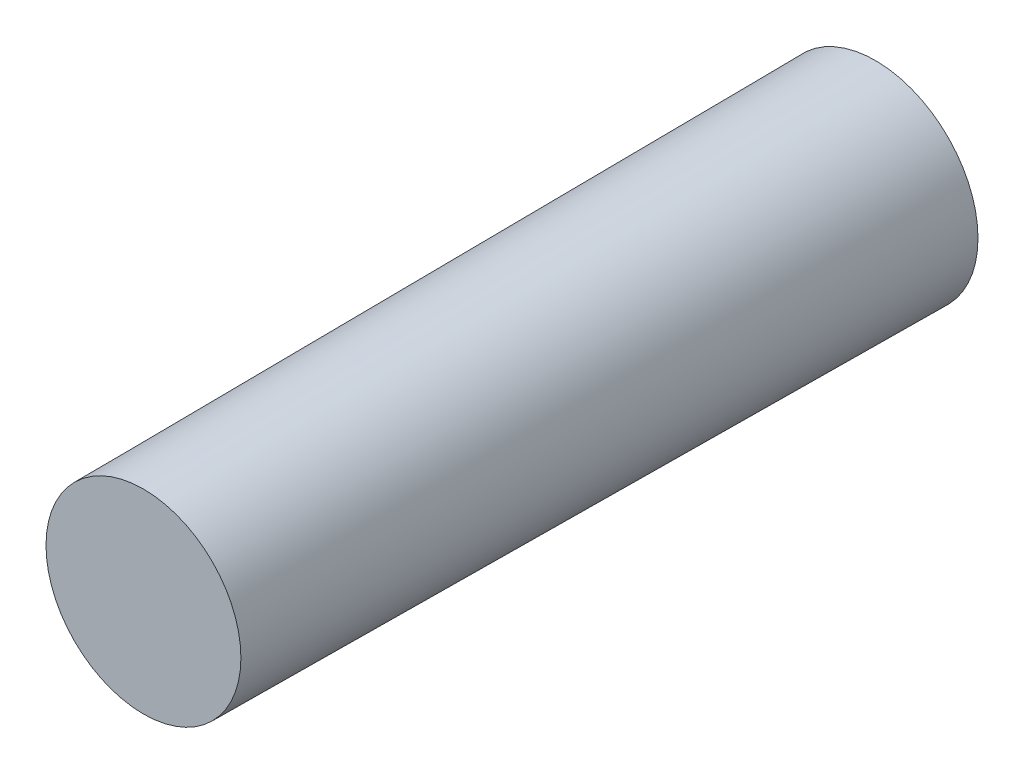
ISO-10303-21;
HEADER;
FILE_DESCRIPTION(('STEP AP214'),'2;1');
FILE_NAME('part.step','',(''),(''),'','','');
FILE_SCHEMA(('AUTOMOTIVE_DESIGN { 1 0 10303 214 1 1 1 1 }'));
ENDSEC;
DATA;
#1=APPLICATION_CONTEXT('core data for automotive mechanical design processes');
#2=APPLICATION_PROTOCOL_DEFINITION('international standard','automotive_design',2000,#1);
#3=PRODUCT_CONTEXT('',#1,'mechanical');
#4=PRODUCT('Part','Part','',(#3));
#5=PRODUCT_RELATED_PRODUCT_CATEGORY('part','',(#4));
#6=PRODUCT_DEFINITION_FORMATION('','',#4);
#7=PRODUCT_DEFINITION_CONTEXT('part definition',#1,'design');
#8=PRODUCT_DEFINITION('design','',#6,#7);
#9=PRODUCT_DEFINITION_SHAPE('','',#8);
#10=(LENGTH_UNIT() NAMED_UNIT(*) SI_UNIT(.MILLI.,.METRE.));
#11=(NAMED_UNIT(*) PLANE_ANGLE_UNIT() SI_UNIT($,.RADIAN.));
#12=(NAMED_UNIT(*) SI_UNIT($,.STERADIAN.) SOLID_ANGLE_UNIT());
#13=UNCERTAINTY_MEASURE_WITH_UNIT(LENGTH_MEASURE(1.E-05),#10,'distance_accuracy_value','');
#14=(GEOMETRIC_REPRESENTATION_CONTEXT(3) GLOBAL_UNCERTAINTY_ASSIGNED_CONTEXT((#13)) GLOBAL_UNIT_ASSIGNED_CONTEXT((#10,
#11,#12)) REPRESENTATION_CONTEXT('',''));
#15=CARTESIAN_POINT('',(0.,0.,0.));
#16=DIRECTION('',(0.,0.,1.));
#17=DIRECTION('',(1.,0.,0.));
#18=AXIS2_PLACEMENT_3D('',#15,#16,#17);
#19=CARTESIAN_POINT('',(0.,0.,0.));
#20=DIRECTION('',(0.,0.,-1.));
#21=DIRECTION('',(1.,0.,0.));
#22=AXIS2_PLACEMENT_3D('',#19,#20,#21);
#23=CONICAL_SURFACE('',#22,7.6835,0.00698131700797733);
#24=CARTESIAN_POINT('',(0.,0.,54.8386));
#25=DIRECTION('',(0.,0.,1.));
#26=DIRECTION('',(1.,0.,0.));
#27=AXIS2_PLACEMENT_3D('',#24,#25,#26);
#28=CIRCLE('',#27,7.30064812919418);
#29=CARTESIAN_POINT('',(7.30064812919418,0.,54.8386));
#30=VERTEX_POINT('',#29);
#31=EDGE_CURVE('E10',#30,#30,#28,.T.);
#32=ORIENTED_EDGE('',*,*,#31,.F.);
#33=EDGE_LOOP('',(#32));
#34=FACE_BOUND('',#33,.T.);
#35=CARTESIAN_POINT('',(0.,0.,0.));
#36=DIRECTION('',(0.,0.,1.));
#37=DIRECTION('',(1.,0.,0.));
#38=AXIS2_PLACEMENT_3D('',#35,#36,#37);
#39=CIRCLE('',#38,7.6835);
#40=CARTESIAN_POINT('',(7.6835,0.,0.));
#41=VERTEX_POINT('',#40);
#42=EDGE_CURVE('E52',#41,#41,#39,.T.);
#43=ORIENTED_EDGE('',*,*,#42,.T.);
#44=EDGE_LOOP('',(#43));
#45=FACE_BOUND('',#44,.T.);
#46=ADVANCED_FACE('F45',(#34,#45),#23,.T.);
#47=CARTESIAN_POINT('',(0.,0.,54.8386));
#48=DIRECTION('',(0.,0.,1.));
#49=DIRECTION('',(1.,0.,0.));
#50=AXIS2_PLACEMENT_3D('',#47,#48,#49);
#51=PLANE('',#50);
#52=ORIENTED_EDGE('',*,*,#31,.T.);
#53=EDGE_LOOP('',(#52));
#54=FACE_BOUND('',#53,.T.);
#55=ADVANCED_FACE('F62',(#54),#51,.T.);
#56=CARTESIAN_POINT('',(0.,0.,0.));
#57=DIRECTION('',(0.,0.,1.));
#58=DIRECTION('',(1.,0.,0.));
#59=AXIS2_PLACEMENT_3D('',#56,#57,#58);
#60=PLANE('',#59);
#61=ORIENTED_EDGE('',*,*,#42,.F.);
#62=EDGE_LOOP('',(#61));
#63=FACE_BOUND('',#62,.T.);
#64=ADVANCED_FACE('F60',(#63),#60,.F.);
#65=CLOSED_SHELL('',(#46,#55,#64));
#66=MANIFOLD_SOLID_BREP('B2',#65);
#67=ADVANCED_BREP_SHAPE_REPRESENTATION('',(#18,#66),#14);
#68=SHAPE_DEFINITION_REPRESENTATION(#9,#67);
ENDSEC;
END-ISO-10303-21;
